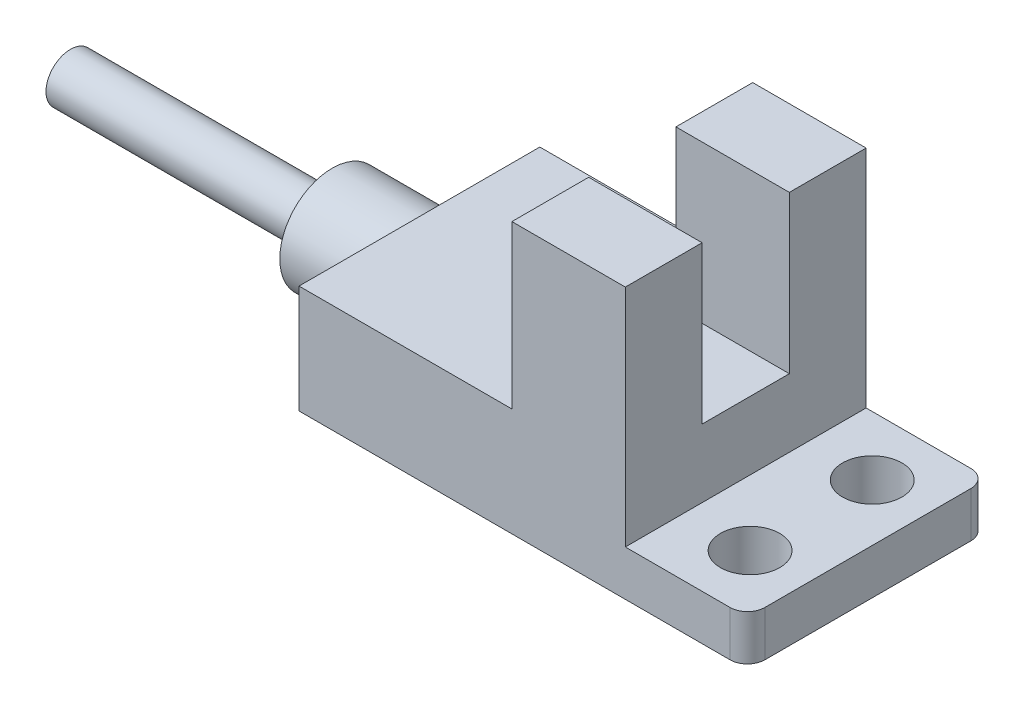
ISO-10303-21;
HEADER;
FILE_DESCRIPTION(('STEP AP214'),'2;1');
FILE_NAME('part.step','',(''),(''),'','','');
FILE_SCHEMA(('AUTOMOTIVE_DESIGN { 1 0 10303 214 1 1 1 1 }'));
ENDSEC;
DATA;
#1=APPLICATION_CONTEXT('core data for automotive mechanical design processes');
#2=APPLICATION_PROTOCOL_DEFINITION('international standard','automotive_design',2000,#1);
#3=PRODUCT_CONTEXT('',#1,'mechanical');
#4=PRODUCT('Part','Part','',(#3));
#5=PRODUCT_RELATED_PRODUCT_CATEGORY('part','',(#4));
#6=PRODUCT_DEFINITION_FORMATION('','',#4);
#7=PRODUCT_DEFINITION_CONTEXT('part definition',#1,'design');
#8=PRODUCT_DEFINITION('design','',#6,#7);
#9=PRODUCT_DEFINITION_SHAPE('','',#8);
#10=(LENGTH_UNIT() NAMED_UNIT(*) SI_UNIT(.MILLI.,.METRE.));
#11=(NAMED_UNIT(*) PLANE_ANGLE_UNIT() SI_UNIT($,.RADIAN.));
#12=(NAMED_UNIT(*) SI_UNIT($,.STERADIAN.) SOLID_ANGLE_UNIT());
#13=UNCERTAINTY_MEASURE_WITH_UNIT(LENGTH_MEASURE(1.E-05),#10,'distance_accuracy_value','');
#14=(GEOMETRIC_REPRESENTATION_CONTEXT(3) GLOBAL_UNCERTAINTY_ASSIGNED_CONTEXT((#13)) GLOBAL_UNIT_ASSIGNED_CONTEXT((#10,
#11,#12)) REPRESENTATION_CONTEXT('',''));
#15=CARTESIAN_POINT('',(0.,0.,0.));
#16=DIRECTION('',(0.,0.,1.));
#17=DIRECTION('',(1.,0.,0.));
#18=AXIS2_PLACEMENT_3D('',#15,#16,#17);
#19=CARTESIAN_POINT('',(3.25,15.5,6.9));
#20=DIRECTION('',(0.,-1.,0.));
#21=DIRECTION('',(0.,0.,-1.));
#22=AXIS2_PLACEMENT_3D('',#19,#20,#21);
#23=PLANE('',#22);
#24=DIRECTION('',(0.,0.,-1.));
#25=VECTOR('',#24,1.);
#26=CARTESIAN_POINT('',(3.25,15.5,6.9));
#27=LINE('',#26,#25);
#28=CARTESIAN_POINT('',(3.25,15.5,6.9));
#29=VERTEX_POINT('',#28);
#30=CARTESIAN_POINT('',(3.25,15.5,2.5));
#31=VERTEX_POINT('',#30);
#32=EDGE_CURVE('E209',#29,#31,#27,.T.);
#33=ORIENTED_EDGE('',*,*,#32,.T.);
#34=DIRECTION('',(1.,0.,0.));
#35=VECTOR('',#34,1.);
#36=CARTESIAN_POINT('',(-15.45,15.5,2.5));
#37=LINE('',#36,#35);
#38=CARTESIAN_POINT('',(-3.25,15.5,2.5));
#39=VERTEX_POINT('',#38);
#40=EDGE_CURVE('E149',#39,#31,#37,.T.);
#41=ORIENTED_EDGE('',*,*,#40,.F.);
#42=DIRECTION('',(0.,0.,-1.));
#43=VECTOR('',#42,1.);
#44=CARTESIAN_POINT('',(-3.25,15.5,6.9));
#45=LINE('',#44,#43);
#46=CARTESIAN_POINT('',(-3.25,15.5,6.9));
#47=VERTEX_POINT('',#46);
#48=EDGE_CURVE('E206',#47,#39,#45,.T.);
#49=ORIENTED_EDGE('',*,*,#48,.F.);
#50=DIRECTION('',(-1.,0.,0.));
#51=VECTOR('',#50,1.);
#52=CARTESIAN_POINT('',(3.25,15.5,6.9));
#53=LINE('',#52,#51);
#54=EDGE_CURVE('E179',#29,#47,#53,.T.);
#55=ORIENTED_EDGE('',*,*,#54,.F.);
#56=EDGE_LOOP('',(#33,#41,#49,#55));
#57=FACE_BOUND('',#56,.T.);
#58=ADVANCED_FACE('F35',(#57),#23,.F.);
#59=CARTESIAN_POINT('',(-15.45,6.2,6.9));
#60=DIRECTION('',(1.,0.,0.));
#61=DIRECTION('',(0.,0.,-1.));
#62=AXIS2_PLACEMENT_3D('',#59,#60,#61);
#63=PLANE('',#62);
#64=CARTESIAN_POINT('',(-15.45,3.1,0.));
#65=DIRECTION('',(-1.,0.,0.));
#66=DIRECTION('',(0.,0.,1.));
#67=AXIS2_PLACEMENT_3D('',#64,#65,#66);
#68=CIRCLE('',#67,3.);
#69=CARTESIAN_POINT('',(-15.45,3.1,3.));
#70=VERTEX_POINT('',#69);
#71=EDGE_CURVE('E230',#70,#70,#68,.T.);
#72=ORIENTED_EDGE('',*,*,#71,.F.);
#73=EDGE_LOOP('',(#72));
#74=FACE_BOUND('',#73,.T.);
#75=DIRECTION('',(0.,-1.,0.));
#76=VECTOR('',#75,1.);
#77=CARTESIAN_POINT('',(-15.45,6.2,-6.9));
#78=LINE('',#77,#76);
#79=CARTESIAN_POINT('',(-15.45,6.2,-6.9));
#80=VERTEX_POINT('',#79);
#81=CARTESIAN_POINT('',(-15.45,0.,-6.9));
#82=VERTEX_POINT('',#81);
#83=EDGE_CURVE('E165',#80,#82,#78,.T.);
#84=ORIENTED_EDGE('',*,*,#83,.T.);
#85=DIRECTION('',(0.,0.,-1.));
#86=VECTOR('',#85,1.);
#87=CARTESIAN_POINT('',(-15.45,0.,6.9));
#88=LINE('',#87,#86);
#89=CARTESIAN_POINT('',(-15.45,0.,6.9));
#90=VERTEX_POINT('',#89);
#91=EDGE_CURVE('E221',#90,#82,#88,.T.);
#92=ORIENTED_EDGE('',*,*,#91,.F.);
#93=DIRECTION('',(0.,-1.,0.));
#94=VECTOR('',#93,1.);
#95=CARTESIAN_POINT('',(-15.45,6.2,6.9));
#96=LINE('',#95,#94);
#97=CARTESIAN_POINT('',(-15.45,6.2,6.9));
#98=VERTEX_POINT('',#97);
#99=EDGE_CURVE('E169',#98,#90,#96,.T.);
#100=ORIENTED_EDGE('',*,*,#99,.F.);
#101=DIRECTION('',(0.,0.,-1.));
#102=VECTOR('',#101,1.);
#103=CARTESIAN_POINT('',(-15.45,6.2,6.9));
#104=LINE('',#103,#102);
#105=EDGE_CURVE('E185',#98,#80,#104,.T.);
#106=ORIENTED_EDGE('',*,*,#105,.T.);
#107=EDGE_LOOP('',(#84,#92,#100,#106));
#108=FACE_BOUND('',#107,.T.);
#109=ADVANCED_FACE('F271',(#74,#108),#63,.F.);
#110=CARTESIAN_POINT('',(-15.45,0.,6.9));
#111=DIRECTION('',(0.,1.,0.));
#112=DIRECTION('',(-1.,0.,0.));
#113=AXIS2_PLACEMENT_3D('',#110,#111,#112);
#114=PLANE('',#113);
#115=CARTESIAN_POINT('',(7.,0.,-3.5));
#116=DIRECTION('',(0.,1.,0.));
#117=DIRECTION('',(0.,0.,1.));
#118=AXIS2_PLACEMENT_3D('',#115,#116,#117);
#119=CIRCLE('',#118,1.7);
#120=CARTESIAN_POINT('',(7.,0.,-1.8));
#121=VERTEX_POINT('',#120);
#122=EDGE_CURVE('E306',#121,#121,#119,.T.);
#123=ORIENTED_EDGE('',*,*,#122,.T.);
#124=EDGE_LOOP('',(#123));
#125=FACE_BOUND('',#124,.T.);
#126=CARTESIAN_POINT('',(7.,0.,3.5));
#127=DIRECTION('',(0.,1.,0.));
#128=DIRECTION('',(0.,0.,1.));
#129=AXIS2_PLACEMENT_3D('',#126,#127,#128);
#130=CIRCLE('',#129,1.7);
#131=CARTESIAN_POINT('',(7.,0.,5.2));
#132=VERTEX_POINT('',#131);
#133=EDGE_CURVE('E297',#132,#132,#130,.T.);
#134=ORIENTED_EDGE('',*,*,#133,.T.);
#135=EDGE_LOOP('',(#134));
#136=FACE_BOUND('',#135,.T.);
#137=DIRECTION('',(1.,0.,0.));
#138=VECTOR('',#137,1.);
#139=CARTESIAN_POINT('',(-15.45,0.,-6.9));
#140=LINE('',#139,#138);
#141=CARTESIAN_POINT('',(9.24999999999999,0.,-6.9));
#142=VERTEX_POINT('',#141);
#143=EDGE_CURVE('E188',#82,#142,#140,.T.);
#144=ORIENTED_EDGE('',*,*,#143,.T.);
#145=CARTESIAN_POINT('',(9.25,0.,-5.9));
#146=DIRECTION('',(0.,1.,0.));
#147=DIRECTION('',(-1.,0.,0.));
#148=AXIS2_PLACEMENT_3D('',#145,#146,#147);
#149=CIRCLE('',#148,1.);
#150=CARTESIAN_POINT('',(10.25,0.,-5.9));
#151=VERTEX_POINT('',#150);
#152=EDGE_CURVE('E43',#142,#151,#149,.F.);
#153=ORIENTED_EDGE('',*,*,#152,.T.);
#154=DIRECTION('',(0.,0.,-1.));
#155=VECTOR('',#154,1.);
#156=CARTESIAN_POINT('',(10.25,0.,6.9));
#157=LINE('',#156,#155);
#158=CARTESIAN_POINT('',(10.25,0.,5.9));
#159=VERTEX_POINT('',#158);
#160=EDGE_CURVE('E218',#159,#151,#157,.T.);
#161=ORIENTED_EDGE('',*,*,#160,.F.);
#162=CARTESIAN_POINT('',(9.25,0.,5.9));
#163=DIRECTION('',(0.,1.,0.));
#164=DIRECTION('',(-1.,0.,0.));
#165=AXIS2_PLACEMENT_3D('',#162,#163,#164);
#166=CIRCLE('',#165,1.);
#167=CARTESIAN_POINT('',(9.24999999999999,0.,6.9));
#168=VERTEX_POINT('',#167);
#169=EDGE_CURVE('E50',#159,#168,#166,.F.);
#170=ORIENTED_EDGE('',*,*,#169,.T.);
#171=DIRECTION('',(1.,0.,0.));
#172=VECTOR('',#171,1.);
#173=CARTESIAN_POINT('',(-15.45,0.,6.9));
#174=LINE('',#173,#172);
#175=EDGE_CURVE('E172',#90,#168,#174,.T.);
#176=ORIENTED_EDGE('',*,*,#175,.F.);
#177=ORIENTED_EDGE('',*,*,#91,.T.);
#178=EDGE_LOOP('',(#144,#153,#161,#170,#176,#177));
#179=FACE_BOUND('',#178,.T.);
#180=ADVANCED_FACE('F243',(#125,#136,#179),#114,.F.);
#181=CARTESIAN_POINT('',(10.25,0.,6.9));
#182=DIRECTION('',(-1.,0.,0.));
#183=DIRECTION('',(0.,0.,1.));
#184=AXIS2_PLACEMENT_3D('',#181,#182,#183);
#185=PLANE('',#184);
#186=ORIENTED_EDGE('',*,*,#160,.T.);
#187=DIRECTION('',(0.,1.,0.));
#188=VECTOR('',#187,1.);
#189=CARTESIAN_POINT('',(10.25,0.,-5.9));
#190=LINE('',#189,#188);
#191=CARTESIAN_POINT('',(10.25,2.6,-5.9));
#192=VERTEX_POINT('',#191);
#193=EDGE_CURVE('E233',#151,#192,#190,.T.);
#194=ORIENTED_EDGE('',*,*,#193,.T.);
#195=DIRECTION('',(0.,0.,-1.));
#196=VECTOR('',#195,1.);
#197=CARTESIAN_POINT('',(10.25,2.6,6.9));
#198=LINE('',#197,#196);
#199=CARTESIAN_POINT('',(10.25,2.6,5.9));
#200=VERTEX_POINT('',#199);
#201=EDGE_CURVE('E215',#200,#192,#198,.T.);
#202=ORIENTED_EDGE('',*,*,#201,.F.);
#203=DIRECTION('',(0.,1.,0.));
#204=VECTOR('',#203,1.);
#205=CARTESIAN_POINT('',(10.25,0.,5.9));
#206=LINE('',#205,#204);
#207=EDGE_CURVE('E231',#200,#159,#206,.F.);
#208=ORIENTED_EDGE('',*,*,#207,.T.);
#209=EDGE_LOOP('',(#186,#194,#202,#208));
#210=FACE_BOUND('',#209,.T.);
#211=ADVANCED_FACE('F247',(#210),#185,.F.);
#212=CARTESIAN_POINT('',(10.25,2.6,6.9));
#213=DIRECTION('',(0.,-1.,0.));
#214=DIRECTION('',(1.,0.,0.));
#215=AXIS2_PLACEMENT_3D('',#212,#213,#214);
#216=PLANE('',#215);
#217=CARTESIAN_POINT('',(7.,2.6,-3.5));
#218=DIRECTION('',(0.,1.,0.));
#219=DIRECTION('',(0.,0.,1.));
#220=AXIS2_PLACEMENT_3D('',#217,#218,#219);
#221=CIRCLE('',#220,1.69999999999999);
#222=CARTESIAN_POINT('',(7.,2.6,-1.80000000000001));
#223=VERTEX_POINT('',#222);
#224=EDGE_CURVE('E309',#223,#223,#221,.T.);
#225=ORIENTED_EDGE('',*,*,#224,.F.);
#226=EDGE_LOOP('',(#225));
#227=FACE_BOUND('',#226,.T.);
#228=CARTESIAN_POINT('',(7.,2.6,3.5));
#229=DIRECTION('',(0.,1.,0.));
#230=DIRECTION('',(0.,0.,1.));
#231=AXIS2_PLACEMENT_3D('',#228,#229,#230);
#232=CIRCLE('',#231,1.69999999999999);
#233=CARTESIAN_POINT('',(7.,2.6,5.19999999999999));
#234=VERTEX_POINT('',#233);
#235=EDGE_CURVE('E299',#234,#234,#232,.T.);
#236=ORIENTED_EDGE('',*,*,#235,.F.);
#237=EDGE_LOOP('',(#236));
#238=FACE_BOUND('',#237,.T.);
#239=ORIENTED_EDGE('',*,*,#201,.T.);
#240=CARTESIAN_POINT('',(9.25,2.6,-5.9));
#241=DIRECTION('',(0.,-1.,0.));
#242=DIRECTION('',(1.,0.,0.));
#243=AXIS2_PLACEMENT_3D('',#240,#241,#242);
#244=CIRCLE('',#243,1.);
#245=CARTESIAN_POINT('',(9.25,2.6,-6.9));
#246=VERTEX_POINT('',#245);
#247=EDGE_CURVE('E239',#192,#246,#244,.F.);
#248=ORIENTED_EDGE('',*,*,#247,.T.);
#249=DIRECTION('',(-1.,0.,0.));
#250=VECTOR('',#249,1.);
#251=CARTESIAN_POINT('',(10.25,2.6,-6.9));
#252=LINE('',#251,#250);
#253=CARTESIAN_POINT('',(3.25,2.6,-6.9));
#254=VERTEX_POINT('',#253);
#255=EDGE_CURVE('E190',#246,#254,#252,.T.);
#256=ORIENTED_EDGE('',*,*,#255,.T.);
#257=DIRECTION('',(0.,0.,-1.));
#258=VECTOR('',#257,1.);
#259=CARTESIAN_POINT('',(3.25,2.6,6.9));
#260=LINE('',#259,#258);
#261=CARTESIAN_POINT('',(3.25,2.6,6.9));
#262=VERTEX_POINT('',#261);
#263=EDGE_CURVE('E212',#262,#254,#260,.T.);
#264=ORIENTED_EDGE('',*,*,#263,.F.);
#265=DIRECTION('',(-1.,0.,0.));
#266=VECTOR('',#265,1.);
#267=CARTESIAN_POINT('',(10.25,2.6,6.9));
#268=LINE('',#267,#266);
#269=CARTESIAN_POINT('',(9.25,2.6,6.9));
#270=VERTEX_POINT('',#269);
#271=EDGE_CURVE('E175',#270,#262,#268,.T.);
#272=ORIENTED_EDGE('',*,*,#271,.F.);
#273=CARTESIAN_POINT('',(9.25,2.6,5.9));
#274=DIRECTION('',(0.,-1.,0.));
#275=DIRECTION('',(1.,0.,0.));
#276=AXIS2_PLACEMENT_3D('',#273,#274,#275);
#277=CIRCLE('',#276,1.);
#278=EDGE_CURVE('E237',#270,#200,#277,.F.);
#279=ORIENTED_EDGE('',*,*,#278,.T.);
#280=EDGE_LOOP('',(#239,#248,#256,#264,#272,#279));
#281=FACE_BOUND('',#280,.T.);
#282=ADVANCED_FACE('F252',(#227,#238,#281),#216,.F.);
#283=CARTESIAN_POINT('',(3.25,2.6,6.9));
#284=DIRECTION('',(-1.,0.,0.));
#285=DIRECTION('',(0.,-1.,0.));
#286=AXIS2_PLACEMENT_3D('',#283,#284,#285);
#287=PLANE('',#286);
#288=DIRECTION('',(0.,0.,1.));
#289=VECTOR('',#288,1.);
#290=CARTESIAN_POINT('',(3.25,6.5,6.9));
#291=LINE('',#290,#289);
#292=CARTESIAN_POINT('',(3.25,6.5,-2.5));
#293=VERTEX_POINT('',#292);
#294=CARTESIAN_POINT('',(3.25,6.5,2.5));
#295=VERTEX_POINT('',#294);
#296=EDGE_CURVE('E138',#293,#295,#291,.T.);
#297=ORIENTED_EDGE('',*,*,#296,.T.);
#298=DIRECTION('',(0.,1.,0.));
#299=VECTOR('',#298,1.);
#300=CARTESIAN_POINT('',(3.25,2.6,2.5));
#301=LINE('',#300,#299);
#302=EDGE_CURVE('E163',#295,#31,#301,.T.);
#303=ORIENTED_EDGE('',*,*,#302,.T.);
#304=ORIENTED_EDGE('',*,*,#32,.F.);
#305=DIRECTION('',(0.,1.,0.));
#306=VECTOR('',#305,1.);
#307=CARTESIAN_POINT('',(3.25,2.6,6.9));
#308=LINE('',#307,#306);
#309=EDGE_CURVE('E177',#262,#29,#308,.T.);
#310=ORIENTED_EDGE('',*,*,#309,.F.);
#311=ORIENTED_EDGE('',*,*,#263,.T.);
#312=DIRECTION('',(0.,1.,0.));
#313=VECTOR('',#312,1.);
#314=CARTESIAN_POINT('',(3.25,2.6,-6.9));
#315=LINE('',#314,#313);
#316=CARTESIAN_POINT('',(3.25,15.5,-6.9));
#317=VERTEX_POINT('',#316);
#318=EDGE_CURVE('E192',#254,#317,#315,.T.);
#319=ORIENTED_EDGE('',*,*,#318,.T.);
#320=CARTESIAN_POINT('',(3.25,15.5,-2.5));
#321=VERTEX_POINT('',#320);
#322=EDGE_CURVE('E162',#321,#317,#27,.T.);
#323=ORIENTED_EDGE('',*,*,#322,.F.);
#324=DIRECTION('',(0.,-1.,0.));
#325=VECTOR('',#324,1.);
#326=CARTESIAN_POINT('',(3.25,2.6,-2.5));
#327=LINE('',#326,#325);
#328=EDGE_CURVE('E148',#321,#293,#327,.T.);
#329=ORIENTED_EDGE('',*,*,#328,.T.);
#330=EDGE_LOOP('',(#297,#303,#304,#310,#311,#319,#323,#329));
#331=FACE_BOUND('',#330,.T.);
#332=ADVANCED_FACE('F160',(#331),#287,.F.);
#333=CARTESIAN_POINT('',(-3.25,15.5,-2.5));
#334=VERTEX_POINT('',#333);
#335=CARTESIAN_POINT('',(-3.25,15.5,-6.9));
#336=VERTEX_POINT('',#335);
#337=EDGE_CURVE('E205',#334,#336,#45,.T.);
#338=ORIENTED_EDGE('',*,*,#337,.F.);
#339=DIRECTION('',(1.,0.,0.));
#340=VECTOR('',#339,1.);
#341=CARTESIAN_POINT('',(-15.45,15.5,-2.5));
#342=LINE('',#341,#340);
#343=EDGE_CURVE('E157',#334,#321,#342,.T.);
#344=ORIENTED_EDGE('',*,*,#343,.T.);
#345=ORIENTED_EDGE('',*,*,#322,.T.);
#346=DIRECTION('',(-1.,0.,0.));
#347=VECTOR('',#346,1.);
#348=CARTESIAN_POINT('',(3.25,15.5,-6.9));
#349=LINE('',#348,#347);
#350=EDGE_CURVE('E194',#317,#336,#349,.T.);
#351=ORIENTED_EDGE('',*,*,#350,.T.);
#352=EDGE_LOOP('',(#338,#344,#345,#351));
#353=FACE_BOUND('',#352,.T.);
#354=ADVANCED_FACE('F274',(#353),#23,.F.);
#355=CARTESIAN_POINT('',(-3.25,15.5,6.9));
#356=DIRECTION('',(1.,0.,0.));
#357=DIRECTION('',(0.,1.,0.));
#358=AXIS2_PLACEMENT_3D('',#355,#356,#357);
#359=PLANE('',#358);
#360=ORIENTED_EDGE('',*,*,#48,.T.);
#361=DIRECTION('',(0.,-1.,0.));
#362=VECTOR('',#361,1.);
#363=CARTESIAN_POINT('',(-3.25,15.5,2.5));
#364=LINE('',#363,#362);
#365=CARTESIAN_POINT('',(-3.25,6.5,2.5));
#366=VERTEX_POINT('',#365);
#367=EDGE_CURVE('E227',#39,#366,#364,.T.);
#368=ORIENTED_EDGE('',*,*,#367,.T.);
#369=DIRECTION('',(0.,0.,-1.));
#370=VECTOR('',#369,1.);
#371=CARTESIAN_POINT('',(-3.25,6.5,6.9));
#372=LINE('',#371,#370);
#373=CARTESIAN_POINT('',(-3.25,6.5,-2.5));
#374=VERTEX_POINT('',#373);
#375=EDGE_CURVE('E224',#366,#374,#372,.T.);
#376=ORIENTED_EDGE('',*,*,#375,.T.);
#377=DIRECTION('',(0.,1.,0.));
#378=VECTOR('',#377,1.);
#379=CARTESIAN_POINT('',(-3.25,15.5,-2.5));
#380=LINE('',#379,#378);
#381=EDGE_CURVE('E155',#374,#334,#380,.T.);
#382=ORIENTED_EDGE('',*,*,#381,.T.);
#383=ORIENTED_EDGE('',*,*,#337,.T.);
#384=DIRECTION('',(0.,-1.,0.));
#385=VECTOR('',#384,1.);
#386=CARTESIAN_POINT('',(-3.25,15.5,-6.9));
#387=LINE('',#386,#385);
#388=CARTESIAN_POINT('',(-3.25,6.2,-6.9));
#389=VERTEX_POINT('',#388);
#390=EDGE_CURVE('E197',#336,#389,#387,.T.);
#391=ORIENTED_EDGE('',*,*,#390,.T.);
#392=DIRECTION('',(0.,0.,-1.));
#393=VECTOR('',#392,1.);
#394=CARTESIAN_POINT('',(-3.25,6.2,6.9));
#395=LINE('',#394,#393);
#396=CARTESIAN_POINT('',(-3.25,6.2,6.9));
#397=VERTEX_POINT('',#396);
#398=EDGE_CURVE('E202',#397,#389,#395,.T.);
#399=ORIENTED_EDGE('',*,*,#398,.F.);
#400=DIRECTION('',(0.,-1.,0.));
#401=VECTOR('',#400,1.);
#402=CARTESIAN_POINT('',(-3.25,15.5,6.9));
#403=LINE('',#402,#401);
#404=EDGE_CURVE('E181',#47,#397,#403,.T.);
#405=ORIENTED_EDGE('',*,*,#404,.F.);
#406=EDGE_LOOP('',(#360,#368,#376,#382,#383,#391,#399,#405));
#407=FACE_BOUND('',#406,.T.);
#408=ADVANCED_FACE('F284',(#407),#359,.F.);
#409=CARTESIAN_POINT('',(-3.25,6.2,6.9));
#410=DIRECTION('',(0.,-1.,0.));
#411=DIRECTION('',(1.,0.,0.));
#412=AXIS2_PLACEMENT_3D('',#409,#410,#411);
#413=PLANE('',#412);
#414=DIRECTION('',(-1.,0.,0.));
#415=VECTOR('',#414,1.);
#416=CARTESIAN_POINT('',(-3.25,6.2,-6.9));
#417=LINE('',#416,#415);
#418=EDGE_CURVE('E173',#389,#80,#417,.T.);
#419=ORIENTED_EDGE('',*,*,#418,.T.);
#420=ORIENTED_EDGE('',*,*,#105,.F.);
#421=DIRECTION('',(-1.,0.,0.));
#422=VECTOR('',#421,1.);
#423=CARTESIAN_POINT('',(-3.25,6.2,6.9));
#424=LINE('',#423,#422);
#425=EDGE_CURVE('E183',#397,#98,#424,.T.);
#426=ORIENTED_EDGE('',*,*,#425,.F.);
#427=ORIENTED_EDGE('',*,*,#398,.T.);
#428=EDGE_LOOP('',(#419,#420,#426,#427));
#429=FACE_BOUND('',#428,.T.);
#430=ADVANCED_FACE('F290',(#429),#413,.F.);
#431=CARTESIAN_POINT('',(0.,0.,6.9));
#432=DIRECTION('',(0.,0.,1.));
#433=DIRECTION('',(1.,0.,0.));
#434=AXIS2_PLACEMENT_3D('',#431,#432,#433);
#435=PLANE('',#434);
#436=ORIENTED_EDGE('',*,*,#175,.T.);
#437=DIRECTION('',(0.,1.,0.));
#438=VECTOR('',#437,1.);
#439=CARTESIAN_POINT('',(9.25,2.6,6.9));
#440=LINE('',#439,#438);
#441=EDGE_CURVE('E11',#168,#270,#440,.T.);
#442=ORIENTED_EDGE('',*,*,#441,.T.);
#443=ORIENTED_EDGE('',*,*,#271,.T.);
#444=ORIENTED_EDGE('',*,*,#309,.T.);
#445=ORIENTED_EDGE('',*,*,#54,.T.);
#446=ORIENTED_EDGE('',*,*,#404,.T.);
#447=ORIENTED_EDGE('',*,*,#425,.T.);
#448=ORIENTED_EDGE('',*,*,#99,.T.);
#449=EDGE_LOOP('',(#436,#442,#443,#444,#445,#446,#447,#448));
#450=FACE_BOUND('',#449,.T.);
#451=ADVANCED_FACE('F262',(#450),#435,.T.);
#452=CARTESIAN_POINT('',(0.,0.,-6.9));
#453=DIRECTION('',(0.,0.,1.));
#454=DIRECTION('',(1.,0.,0.));
#455=AXIS2_PLACEMENT_3D('',#452,#453,#454);
#456=PLANE('',#455);
#457=ORIENTED_EDGE('',*,*,#255,.F.);
#458=DIRECTION('',(0.,1.,0.));
#459=VECTOR('',#458,1.);
#460=CARTESIAN_POINT('',(9.25,0.,-6.9));
#461=LINE('',#460,#459);
#462=EDGE_CURVE('E58',#246,#142,#461,.F.);
#463=ORIENTED_EDGE('',*,*,#462,.T.);
#464=ORIENTED_EDGE('',*,*,#143,.F.);
#465=ORIENTED_EDGE('',*,*,#83,.F.);
#466=ORIENTED_EDGE('',*,*,#418,.F.);
#467=ORIENTED_EDGE('',*,*,#390,.F.);
#468=ORIENTED_EDGE('',*,*,#350,.F.);
#469=ORIENTED_EDGE('',*,*,#318,.F.);
#470=EDGE_LOOP('',(#457,#463,#464,#465,#466,#467,#468,#469));
#471=FACE_BOUND('',#470,.T.);
#472=ADVANCED_FACE('F255',(#471),#456,.F.);
#473=CARTESIAN_POINT('',(-15.45,15.5,2.5));
#474=DIRECTION('',(0.,0.,1.));
#475=DIRECTION('',(0.,-1.,0.));
#476=AXIS2_PLACEMENT_3D('',#473,#474,#475);
#477=PLANE('',#476);
#478=DIRECTION('',(1.,0.,0.));
#479=VECTOR('',#478,1.);
#480=CARTESIAN_POINT('',(-15.45,6.5,2.5));
#481=LINE('',#480,#479);
#482=EDGE_CURVE('E144',#366,#295,#481,.T.);
#483=ORIENTED_EDGE('',*,*,#482,.F.);
#484=ORIENTED_EDGE('',*,*,#367,.F.);
#485=ORIENTED_EDGE('',*,*,#40,.T.);
#486=ORIENTED_EDGE('',*,*,#302,.F.);
#487=EDGE_LOOP('',(#483,#484,#485,#486));
#488=FACE_BOUND('',#487,.T.);
#489=ADVANCED_FACE('F295',(#488),#477,.F.);
#490=CARTESIAN_POINT('',(-15.45,15.5,-2.5));
#491=DIRECTION('',(0.,0.,-1.));
#492=DIRECTION('',(0.,1.,0.));
#493=AXIS2_PLACEMENT_3D('',#490,#491,#492);
#494=PLANE('',#493);
#495=ORIENTED_EDGE('',*,*,#343,.F.);
#496=ORIENTED_EDGE('',*,*,#381,.F.);
#497=DIRECTION('',(1.,0.,0.));
#498=VECTOR('',#497,1.);
#499=CARTESIAN_POINT('',(-15.45,6.5,-2.5));
#500=LINE('',#499,#498);
#501=EDGE_CURVE('E141',#374,#293,#500,.T.);
#502=ORIENTED_EDGE('',*,*,#501,.T.);
#503=ORIENTED_EDGE('',*,*,#328,.F.);
#504=EDGE_LOOP('',(#495,#496,#502,#503));
#505=FACE_BOUND('',#504,.T.);
#506=ADVANCED_FACE('F152',(#505),#494,.F.);
#507=CARTESIAN_POINT('',(-15.45,6.5,2.5));
#508=DIRECTION('',(0.,-1.,0.));
#509=DIRECTION('',(0.,0.,-1.));
#510=AXIS2_PLACEMENT_3D('',#507,#508,#509);
#511=PLANE('',#510);
#512=ORIENTED_EDGE('',*,*,#501,.F.);
#513=ORIENTED_EDGE('',*,*,#375,.F.);
#514=ORIENTED_EDGE('',*,*,#482,.T.);
#515=ORIENTED_EDGE('',*,*,#296,.F.);
#516=EDGE_LOOP('',(#512,#513,#514,#515));
#517=FACE_BOUND('',#516,.T.);
#518=ADVANCED_FACE('F140',(#517),#511,.F.);
#519=CARTESIAN_POINT('',(7.,2.6,3.5));
#520=DIRECTION('',(0.,1.,0.));
#521=DIRECTION('',(0.,0.,1.));
#522=AXIS2_PLACEMENT_3D('',#519,#520,#521);
#523=CYLINDRICAL_SURFACE('',#522,1.69999999999999);
#524=ORIENTED_EDGE('',*,*,#133,.F.);
#525=EDGE_LOOP('',(#524));
#526=FACE_BOUND('',#525,.T.);
#527=ORIENTED_EDGE('',*,*,#235,.T.);
#528=EDGE_LOOP('',(#527));
#529=FACE_BOUND('',#528,.T.);
#530=ADVANCED_FACE('F367',(#526,#529),#523,.F.);
#531=CARTESIAN_POINT('',(7.,2.6,-3.5));
#532=DIRECTION('',(0.,1.,0.));
#533=DIRECTION('',(0.,0.,1.));
#534=AXIS2_PLACEMENT_3D('',#531,#532,#533);
#535=CYLINDRICAL_SURFACE('',#534,1.69999999999999);
#536=ORIENTED_EDGE('',*,*,#122,.F.);
#537=EDGE_LOOP('',(#536));
#538=FACE_BOUND('',#537,.T.);
#539=ORIENTED_EDGE('',*,*,#224,.T.);
#540=EDGE_LOOP('',(#539));
#541=FACE_BOUND('',#540,.T.);
#542=ADVANCED_FACE('F339',(#538,#541),#535,.F.);
#543=CARTESIAN_POINT('',(-20.45,3.1,0.));
#544=DIRECTION('',(1.,0.,0.));
#545=DIRECTION('',(0.,0.,-1.));
#546=AXIS2_PLACEMENT_3D('',#543,#544,#545);
#547=CYLINDRICAL_SURFACE('',#546,3.);
#548=CARTESIAN_POINT('',(-20.45,3.1,0.));
#549=DIRECTION('',(-1.,0.,0.));
#550=DIRECTION('',(0.,0.,1.));
#551=AXIS2_PLACEMENT_3D('',#548,#549,#550);
#552=CIRCLE('',#551,3.);
#553=CARTESIAN_POINT('',(-20.45,3.1,3.));
#554=VERTEX_POINT('',#553);
#555=EDGE_CURVE('E312',#554,#554,#552,.T.);
#556=ORIENTED_EDGE('',*,*,#555,.F.);
#557=EDGE_LOOP('',(#556));
#558=FACE_BOUND('',#557,.T.);
#559=ORIENTED_EDGE('',*,*,#71,.T.);
#560=EDGE_LOOP('',(#559));
#561=FACE_BOUND('',#560,.T.);
#562=ADVANCED_FACE('F333',(#558,#561),#547,.T.);
#563=CARTESIAN_POINT('',(-20.45,3.1,0.));
#564=DIRECTION('',(-1.,0.,0.));
#565=DIRECTION('',(0.,0.,1.));
#566=AXIS2_PLACEMENT_3D('',#563,#564,#565);
#567=PLANE('',#566);
#568=CARTESIAN_POINT('',(-20.45,3.1,0.));
#569=DIRECTION('',(-1.,0.,0.));
#570=DIRECTION('',(0.,0.,1.));
#571=AXIS2_PLACEMENT_3D('',#568,#569,#570);
#572=CIRCLE('',#571,1.4);
#573=CARTESIAN_POINT('',(-20.45,3.1,1.4));
#574=VERTEX_POINT('',#573);
#575=EDGE_CURVE('E234',#574,#574,#572,.T.);
#576=ORIENTED_EDGE('',*,*,#575,.F.);
#577=EDGE_LOOP('',(#576));
#578=FACE_BOUND('',#577,.T.);
#579=ORIENTED_EDGE('',*,*,#555,.T.);
#580=EDGE_LOOP('',(#579));
#581=FACE_BOUND('',#580,.T.);
#582=ADVANCED_FACE('F327',(#578,#581),#567,.T.);
#583=CARTESIAN_POINT('',(-35.45,3.1,0.));
#584=DIRECTION('',(1.,0.,0.));
#585=DIRECTION('',(0.,0.,-1.));
#586=AXIS2_PLACEMENT_3D('',#583,#584,#585);
#587=CYLINDRICAL_SURFACE('',#586,1.4);
#588=CARTESIAN_POINT('',(-35.45,3.1,0.));
#589=DIRECTION('',(-1.,0.,0.));
#590=DIRECTION('',(0.,0.,1.));
#591=AXIS2_PLACEMENT_3D('',#588,#589,#590);
#592=CIRCLE('',#591,1.4);
#593=CARTESIAN_POINT('',(-35.45,3.1,1.4));
#594=VERTEX_POINT('',#593);
#595=EDGE_CURVE('E317',#594,#594,#592,.T.);
#596=ORIENTED_EDGE('',*,*,#595,.F.);
#597=EDGE_LOOP('',(#596));
#598=FACE_BOUND('',#597,.T.);
#599=ORIENTED_EDGE('',*,*,#575,.T.);
#600=EDGE_LOOP('',(#599));
#601=FACE_BOUND('',#600,.T.);
#602=ADVANCED_FACE('F324',(#598,#601),#587,.T.);
#603=CARTESIAN_POINT('',(-35.45,3.1,0.));
#604=DIRECTION('',(-1.,0.,0.));
#605=DIRECTION('',(0.,0.,1.));
#606=AXIS2_PLACEMENT_3D('',#603,#604,#605);
#607=PLANE('',#606);
#608=ORIENTED_EDGE('',*,*,#595,.T.);
#609=EDGE_LOOP('',(#608));
#610=FACE_BOUND('',#609,.T.);
#611=ADVANCED_FACE('F269',(#610),#607,.T.);
#612=CARTESIAN_POINT('',(9.25,0.,-5.9));
#613=DIRECTION('',(0.,1.,0.));
#614=DIRECTION('',(0.,0.,1.));
#615=AXIS2_PLACEMENT_3D('',#612,#613,#614);
#616=CYLINDRICAL_SURFACE('',#615,1.);
#617=ORIENTED_EDGE('',*,*,#152,.F.);
#618=ORIENTED_EDGE('',*,*,#462,.F.);
#619=ORIENTED_EDGE('',*,*,#247,.F.);
#620=ORIENTED_EDGE('',*,*,#193,.F.);
#621=EDGE_LOOP('',(#617,#618,#619,#620));
#622=FACE_BOUND('',#621,.T.);
#623=ADVANCED_FACE('F250',(#622),#616,.T.);
#624=CARTESIAN_POINT('',(9.25,0.,5.9));
#625=DIRECTION('',(0.,-1.,0.));
#626=DIRECTION('',(0.,0.,-1.));
#627=AXIS2_PLACEMENT_3D('',#624,#625,#626);
#628=CYLINDRICAL_SURFACE('',#627,1.);
#629=ORIENTED_EDGE('',*,*,#169,.F.);
#630=ORIENTED_EDGE('',*,*,#207,.F.);
#631=ORIENTED_EDGE('',*,*,#278,.F.);
#632=ORIENTED_EDGE('',*,*,#441,.F.);
#633=EDGE_LOOP('',(#629,#630,#631,#632));
#634=FACE_BOUND('',#633,.T.);
#635=ADVANCED_FACE('F37',(#634),#628,.T.);
#636=CLOSED_SHELL('',(#58,#109,#180,#211,#282,#332,#354,#408,#430,#451,#472,#489,#506,#518,#530,
#542,#562,#582,#602,#611,#623,#635));
#637=MANIFOLD_SOLID_BREP('B2',#636);
#638=ADVANCED_BREP_SHAPE_REPRESENTATION('',(#18,#637),#14);
#639=SHAPE_DEFINITION_REPRESENTATION(#9,#638);
ENDSEC;
END-ISO-10303-21;
